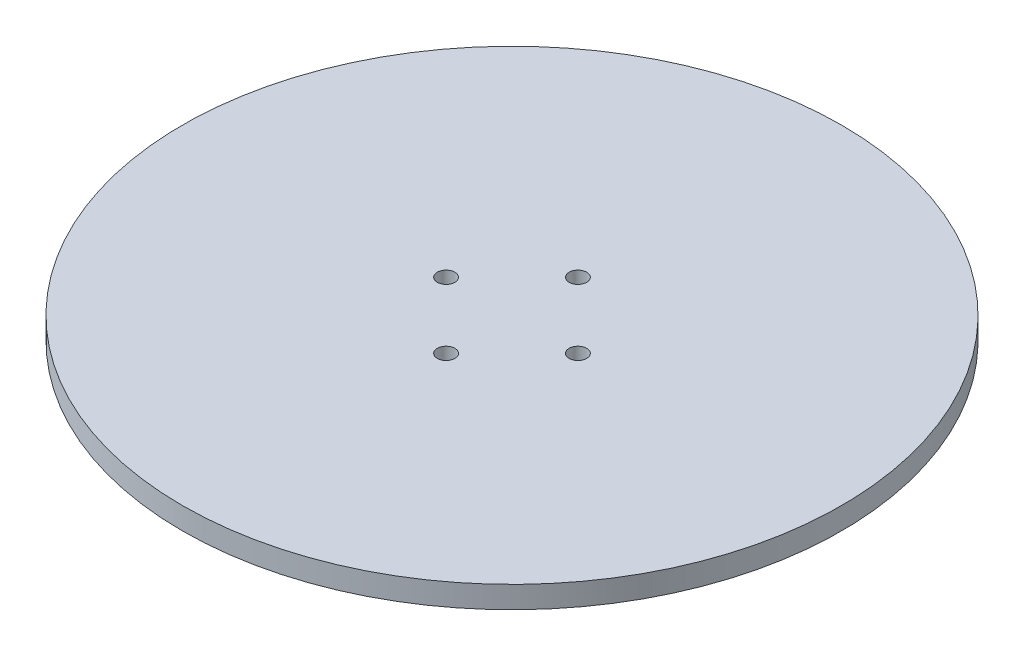
ISO-10303-21;
HEADER;
FILE_DESCRIPTION(('STEP AP214'),'2;1');
FILE_NAME('part.step','',(''),(''),'','','');
FILE_SCHEMA(('AUTOMOTIVE_DESIGN { 1 0 10303 214 1 1 1 1 }'));
ENDSEC;
DATA;
#1=APPLICATION_CONTEXT('core data for automotive mechanical design processes');
#2=APPLICATION_PROTOCOL_DEFINITION('international standard','automotive_design',2000,#1);
#3=PRODUCT_CONTEXT('',#1,'mechanical');
#4=PRODUCT('Part','Part','',(#3));
#5=PRODUCT_RELATED_PRODUCT_CATEGORY('part','',(#4));
#6=PRODUCT_DEFINITION_FORMATION('','',#4);
#7=PRODUCT_DEFINITION_CONTEXT('part definition',#1,'design');
#8=PRODUCT_DEFINITION('design','',#6,#7);
#9=PRODUCT_DEFINITION_SHAPE('','',#8);
#10=(LENGTH_UNIT() NAMED_UNIT(*) SI_UNIT(.MILLI.,.METRE.));
#11=(NAMED_UNIT(*) PLANE_ANGLE_UNIT() SI_UNIT($,.RADIAN.));
#12=(NAMED_UNIT(*) SI_UNIT($,.STERADIAN.) SOLID_ANGLE_UNIT());
#13=UNCERTAINTY_MEASURE_WITH_UNIT(LENGTH_MEASURE(1.E-05),#10,'distance_accuracy_value','');
#14=(GEOMETRIC_REPRESENTATION_CONTEXT(3) GLOBAL_UNCERTAINTY_ASSIGNED_CONTEXT((#13)) GLOBAL_UNIT_ASSIGNED_CONTEXT((#10,
#11,#12)) REPRESENTATION_CONTEXT('',''));
#15=CARTESIAN_POINT('',(0.,0.,0.));
#16=DIRECTION('',(0.,0.,1.));
#17=DIRECTION('',(1.,0.,0.));
#18=AXIS2_PLACEMENT_3D('',#15,#16,#17);
#19=CARTESIAN_POINT('',(0.,5.,0.));
#20=DIRECTION('',(0.,-1.,0.));
#21=DIRECTION('',(0.,0.,-1.));
#22=AXIS2_PLACEMENT_3D('',#19,#20,#21);
#23=CYLINDRICAL_SURFACE('',#22,75.);
#24=CARTESIAN_POINT('',(0.,5.,0.));
#25=DIRECTION('',(0.,1.,0.));
#26=DIRECTION('',(0.,0.,1.));
#27=AXIS2_PLACEMENT_3D('',#24,#25,#26);
#28=CIRCLE('',#27,75.);
#29=CARTESIAN_POINT('',(0.,5.,75.));
#30=VERTEX_POINT('',#29);
#31=EDGE_CURVE('E10',#30,#30,#28,.T.);
#32=ORIENTED_EDGE('',*,*,#31,.F.);
#33=EDGE_LOOP('',(#32));
#34=FACE_BOUND('',#33,.T.);
#35=CARTESIAN_POINT('',(0.,0.,0.));
#36=DIRECTION('',(0.,1.,0.));
#37=DIRECTION('',(0.,0.,1.));
#38=AXIS2_PLACEMENT_3D('',#35,#36,#37);
#39=CIRCLE('',#38,75.);
#40=CARTESIAN_POINT('',(0.,0.,75.));
#41=VERTEX_POINT('',#40);
#42=EDGE_CURVE('E37',#41,#41,#39,.T.);
#43=ORIENTED_EDGE('',*,*,#42,.T.);
#44=EDGE_LOOP('',(#43));
#45=FACE_BOUND('',#44,.T.);
#46=ADVANCED_FACE('F40',(#34,#45),#23,.T.);
#47=CARTESIAN_POINT('',(0.,5.,0.));
#48=DIRECTION('',(0.,1.,0.));
#49=DIRECTION('',(0.,0.,1.));
#50=AXIS2_PLACEMENT_3D('',#47,#48,#49);
#51=PLANE('',#50);
#52=CARTESIAN_POINT('',(-15.,5.,0.));
#53=DIRECTION('',(0.,1.,0.));
#54=DIRECTION('',(1.,0.,0.));
#55=AXIS2_PLACEMENT_3D('',#52,#53,#54);
#56=CIRCLE('',#55,2.);
#57=CARTESIAN_POINT('',(-13.,5.,0.));
#58=VERTEX_POINT('',#57);
#59=EDGE_CURVE('E62',#58,#58,#56,.T.);
#60=ORIENTED_EDGE('',*,*,#59,.F.);
#61=EDGE_LOOP('',(#60));
#62=FACE_BOUND('',#61,.T.);
#63=CARTESIAN_POINT('',(0.,5.,15.));
#64=DIRECTION('',(0.,1.,0.));
#65=DIRECTION('',(0.,0.,-1.));
#66=AXIS2_PLACEMENT_3D('',#63,#64,#65);
#67=CIRCLE('',#66,2.);
#68=CARTESIAN_POINT('',(0.,5.,13.));
#69=VERTEX_POINT('',#68);
#70=EDGE_CURVE('E59',#69,#69,#67,.T.);
#71=ORIENTED_EDGE('',*,*,#70,.F.);
#72=EDGE_LOOP('',(#71));
#73=FACE_BOUND('',#72,.T.);
#74=CARTESIAN_POINT('',(15.,5.,-1.57116660247941E-13));
#75=DIRECTION('',(0.,1.,0.));
#76=DIRECTION('',(-1.,0.,0.));
#77=AXIS2_PLACEMENT_3D('',#74,#75,#76);
#78=CIRCLE('',#77,2.);
#79=CARTESIAN_POINT('',(13.,5.,-1.36167772214882E-13));
#80=VERTEX_POINT('',#79);
#81=EDGE_CURVE('E56',#80,#80,#78,.T.);
#82=ORIENTED_EDGE('',*,*,#81,.F.);
#83=EDGE_LOOP('',(#82));
#84=FACE_BOUND('',#83,.T.);
#85=CARTESIAN_POINT('',(0.,5.,-15.));
#86=DIRECTION('',(0.,1.,0.));
#87=DIRECTION('',(0.,0.,1.));
#88=AXIS2_PLACEMENT_3D('',#85,#86,#87);
#89=CIRCLE('',#88,2.);
#90=CARTESIAN_POINT('',(0.,5.,-13.));
#91=VERTEX_POINT('',#90);
#92=EDGE_CURVE('E51',#91,#91,#89,.T.);
#93=ORIENTED_EDGE('',*,*,#92,.F.);
#94=EDGE_LOOP('',(#93));
#95=FACE_BOUND('',#94,.T.);
#96=ORIENTED_EDGE('',*,*,#31,.T.);
#97=EDGE_LOOP('',(#96));
#98=FACE_BOUND('',#97,.T.);
#99=ADVANCED_FACE('F79',(#62,#73,#84,#95,#98),#51,.T.);
#100=CARTESIAN_POINT('',(0.,0.,0.));
#101=DIRECTION('',(0.,1.,0.));
#102=DIRECTION('',(0.,0.,1.));
#103=AXIS2_PLACEMENT_3D('',#100,#101,#102);
#104=PLANE('',#103);
#105=CARTESIAN_POINT('',(-15.,0.,0.));
#106=DIRECTION('',(0.,1.,0.));
#107=DIRECTION('',(0.,0.,1.));
#108=AXIS2_PLACEMENT_3D('',#105,#106,#107);
#109=CIRCLE('',#108,2.);
#110=CARTESIAN_POINT('',(-15.,0.,2.00000000000005));
#111=VERTEX_POINT('',#110);
#112=EDGE_CURVE('E53',#111,#111,#109,.F.);
#113=ORIENTED_EDGE('',*,*,#112,.F.);
#114=EDGE_LOOP('',(#113));
#115=FACE_BOUND('',#114,.T.);
#116=CARTESIAN_POINT('',(0.,0.,15.));
#117=DIRECTION('',(0.,1.,0.));
#118=DIRECTION('',(0.,0.,1.));
#119=AXIS2_PLACEMENT_3D('',#116,#117,#118);
#120=CIRCLE('',#119,2.);
#121=CARTESIAN_POINT('',(0.,0.,17.));
#122=VERTEX_POINT('',#121);
#123=EDGE_CURVE('E61',#122,#122,#120,.F.);
#124=ORIENTED_EDGE('',*,*,#123,.F.);
#125=EDGE_LOOP('',(#124));
#126=FACE_BOUND('',#125,.T.);
#127=CARTESIAN_POINT('',(15.,0.,-1.57116660247941E-13));
#128=DIRECTION('',(0.,1.,0.));
#129=DIRECTION('',(0.,0.,1.));
#130=AXIS2_PLACEMENT_3D('',#127,#128,#129);
#131=CIRCLE('',#130,2.);
#132=CARTESIAN_POINT('',(15.,0.,1.99999999999984));
#133=VERTEX_POINT('',#132);
#134=EDGE_CURVE('E54',#133,#133,#131,.F.);
#135=ORIENTED_EDGE('',*,*,#134,.F.);
#136=EDGE_LOOP('',(#135));
#137=FACE_BOUND('',#136,.T.);
#138=CARTESIAN_POINT('',(0.,0.,-15.));
#139=DIRECTION('',(0.,1.,0.));
#140=DIRECTION('',(0.,0.,1.));
#141=AXIS2_PLACEMENT_3D('',#138,#139,#140);
#142=CIRCLE('',#141,2.);
#143=CARTESIAN_POINT('',(0.,0.,-13.));
#144=VERTEX_POINT('',#143);
#145=EDGE_CURVE('E50',#144,#144,#142,.F.);
#146=ORIENTED_EDGE('',*,*,#145,.F.);
#147=EDGE_LOOP('',(#146));
#148=FACE_BOUND('',#147,.T.);
#149=ORIENTED_EDGE('',*,*,#42,.F.);
#150=EDGE_LOOP('',(#149));
#151=FACE_BOUND('',#150,.T.);
#152=ADVANCED_FACE('F78',(#115,#126,#137,#148,#151),#104,.F.);
#153=CARTESIAN_POINT('',(0.,-0.00100000000000013,-15.));
#154=DIRECTION('',(0.,1.,0.));
#155=DIRECTION('',(0.,0.,1.));
#156=AXIS2_PLACEMENT_3D('',#153,#154,#155);
#157=CYLINDRICAL_SURFACE('',#156,2.);
#158=ORIENTED_EDGE('',*,*,#92,.T.);
#159=EDGE_LOOP('',(#158));
#160=FACE_BOUND('',#159,.T.);
#161=ORIENTED_EDGE('',*,*,#145,.T.);
#162=EDGE_LOOP('',(#161));
#163=FACE_BOUND('',#162,.T.);
#164=ADVANCED_FACE('F87',(#160,#163),#157,.F.);
#165=CARTESIAN_POINT('',(15.,-0.00100000000000013,-1.57116660247941E-13));
#166=DIRECTION('',(0.,1.,0.));
#167=DIRECTION('',(0.,0.,1.));
#168=AXIS2_PLACEMENT_3D('',#165,#166,#167);
#169=CYLINDRICAL_SURFACE('',#168,2.);
#170=ORIENTED_EDGE('',*,*,#81,.T.);
#171=EDGE_LOOP('',(#170));
#172=FACE_BOUND('',#171,.T.);
#173=ORIENTED_EDGE('',*,*,#134,.T.);
#174=EDGE_LOOP('',(#173));
#175=FACE_BOUND('',#174,.T.);
#176=ADVANCED_FACE('F89',(#172,#175),#169,.F.);
#177=CARTESIAN_POINT('',(0.,-0.00100000000000013,15.));
#178=DIRECTION('',(0.,1.,0.));
#179=DIRECTION('',(0.,0.,1.));
#180=AXIS2_PLACEMENT_3D('',#177,#178,#179);
#181=CYLINDRICAL_SURFACE('',#180,2.);
#182=ORIENTED_EDGE('',*,*,#70,.T.);
#183=EDGE_LOOP('',(#182));
#184=FACE_BOUND('',#183,.T.);
#185=ORIENTED_EDGE('',*,*,#123,.T.);
#186=EDGE_LOOP('',(#185));
#187=FACE_BOUND('',#186,.T.);
#188=ADVANCED_FACE('F123',(#184,#187),#181,.F.);
#189=CARTESIAN_POINT('',(-15.,-0.00100000000000013,0.));
#190=DIRECTION('',(0.,1.,0.));
#191=DIRECTION('',(0.,0.,1.));
#192=AXIS2_PLACEMENT_3D('',#189,#190,#191);
#193=CYLINDRICAL_SURFACE('',#192,2.);
#194=ORIENTED_EDGE('',*,*,#59,.T.);
#195=EDGE_LOOP('',(#194));
#196=FACE_BOUND('',#195,.T.);
#197=ORIENTED_EDGE('',*,*,#112,.T.);
#198=EDGE_LOOP('',(#197));
#199=FACE_BOUND('',#198,.T.);
#200=ADVANCED_FACE('F71',(#196,#199),#193,.F.);
#201=CLOSED_SHELL('',(#46,#99,#152,#164,#176,#188,#200));
#202=MANIFOLD_SOLID_BREP('B2',#201);
#203=ADVANCED_BREP_SHAPE_REPRESENTATION('',(#18,#202),#14);
#204=SHAPE_DEFINITION_REPRESENTATION(#9,#203);
ENDSEC;
END-ISO-10303-21;
